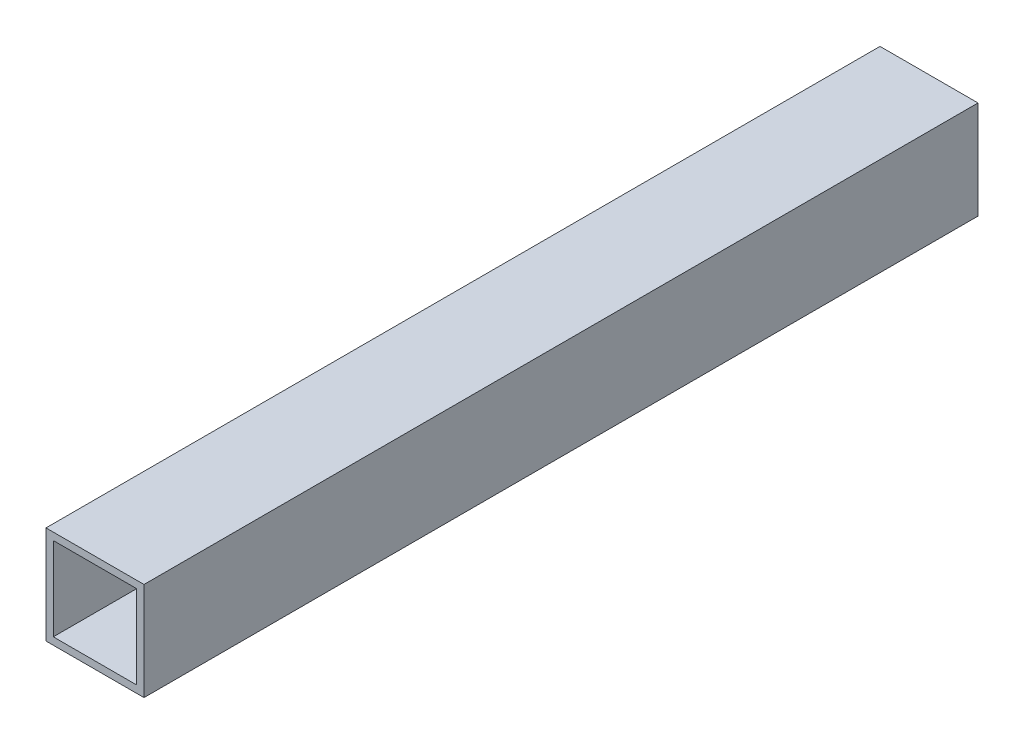
ISO-10303-21;
HEADER;
FILE_DESCRIPTION(('STEP AP214'),'2;1');
FILE_NAME('part.step','',(''),(''),'','','');
FILE_SCHEMA(('AUTOMOTIVE_DESIGN { 1 0 10303 214 1 1 1 1 }'));
ENDSEC;
DATA;
#1=APPLICATION_CONTEXT('core data for automotive mechanical design processes');
#2=APPLICATION_PROTOCOL_DEFINITION('international standard','automotive_design',2000,#1);
#3=PRODUCT_CONTEXT('',#1,'mechanical');
#4=PRODUCT('Part','Part','',(#3));
#5=PRODUCT_RELATED_PRODUCT_CATEGORY('part','',(#4));
#6=PRODUCT_DEFINITION_FORMATION('','',#4);
#7=PRODUCT_DEFINITION_CONTEXT('part definition',#1,'design');
#8=PRODUCT_DEFINITION('design','',#6,#7);
#9=PRODUCT_DEFINITION_SHAPE('','',#8);
#10=(LENGTH_UNIT() NAMED_UNIT(*) SI_UNIT(.MILLI.,.METRE.));
#11=(NAMED_UNIT(*) PLANE_ANGLE_UNIT() SI_UNIT($,.RADIAN.));
#12=(NAMED_UNIT(*) SI_UNIT($,.STERADIAN.) SOLID_ANGLE_UNIT());
#13=UNCERTAINTY_MEASURE_WITH_UNIT(LENGTH_MEASURE(1.E-05),#10,'distance_accuracy_value','');
#14=(GEOMETRIC_REPRESENTATION_CONTEXT(3) GLOBAL_UNCERTAINTY_ASSIGNED_CONTEXT((#13)) GLOBAL_UNIT_ASSIGNED_CONTEXT((#10,
#11,#12)) REPRESENTATION_CONTEXT('',''));
#15=CARTESIAN_POINT('',(0.,0.,0.));
#16=DIRECTION('',(0.,0.,1.));
#17=DIRECTION('',(1.,0.,0.));
#18=AXIS2_PLACEMENT_3D('',#15,#16,#17);
#19=CARTESIAN_POINT('',(0.,0.,200.));
#20=DIRECTION('',(0.,0.,-1.));
#21=DIRECTION('',(-1.,0.,0.));
#22=AXIS2_PLACEMENT_3D('',#19,#20,#21);
#23=PLANE('',#22);
#24=DIRECTION('',(0.,1.,0.));
#25=VECTOR('',#24,1.);
#26=CARTESIAN_POINT('',(11.75,-11.75,200.));
#27=LINE('',#26,#25);
#28=CARTESIAN_POINT('',(11.75,-11.75,200.));
#29=VERTEX_POINT('',#28);
#30=CARTESIAN_POINT('',(11.75,11.75,200.));
#31=VERTEX_POINT('',#30);
#32=EDGE_CURVE('E135',#29,#31,#27,.T.);
#33=ORIENTED_EDGE('',*,*,#32,.T.);
#34=DIRECTION('',(-1.,0.,0.));
#35=VECTOR('',#34,1.);
#36=CARTESIAN_POINT('',(-11.75,11.75,200.));
#37=LINE('',#36,#35);
#38=CARTESIAN_POINT('',(-11.75,11.75,200.));
#39=VERTEX_POINT('',#38);
#40=EDGE_CURVE('E138',#31,#39,#37,.T.);
#41=ORIENTED_EDGE('',*,*,#40,.T.);
#42=DIRECTION('',(0.,-1.,0.));
#43=VECTOR('',#42,1.);
#44=CARTESIAN_POINT('',(-11.75,-11.75,200.));
#45=LINE('',#44,#43);
#46=CARTESIAN_POINT('',(-11.75,-11.75,200.));
#47=VERTEX_POINT('',#46);
#48=EDGE_CURVE('E141',#39,#47,#45,.T.);
#49=ORIENTED_EDGE('',*,*,#48,.T.);
#50=DIRECTION('',(1.,0.,0.));
#51=VECTOR('',#50,1.);
#52=CARTESIAN_POINT('',(-11.75,-11.75,200.));
#53=LINE('',#52,#51);
#54=EDGE_CURVE('E143',#47,#29,#53,.T.);
#55=ORIENTED_EDGE('',*,*,#54,.T.);
#56=EDGE_LOOP('',(#33,#41,#49,#55));
#57=FACE_BOUND('',#56,.T.);
#58=DIRECTION('',(0.,1.,0.));
#59=VECTOR('',#58,1.);
#60=CARTESIAN_POINT('',(10.,-10.,200.));
#61=LINE('',#60,#59);
#62=CARTESIAN_POINT('',(10.,-10.,200.));
#63=VERTEX_POINT('',#62);
#64=CARTESIAN_POINT('',(10.,10.,200.));
#65=VERTEX_POINT('',#64);
#66=EDGE_CURVE('E98',#63,#65,#61,.T.);
#67=ORIENTED_EDGE('',*,*,#66,.F.);
#68=DIRECTION('',(1.,0.,0.));
#69=VECTOR('',#68,1.);
#70=CARTESIAN_POINT('',(-10.,-10.,200.));
#71=LINE('',#70,#69);
#72=CARTESIAN_POINT('',(-10.,-10.,200.));
#73=VERTEX_POINT('',#72);
#74=EDGE_CURVE('E120',#73,#63,#71,.T.);
#75=ORIENTED_EDGE('',*,*,#74,.F.);
#76=DIRECTION('',(0.,-1.,0.));
#77=VECTOR('',#76,1.);
#78=CARTESIAN_POINT('',(-10.,-10.,200.));
#79=LINE('',#78,#77);
#80=CARTESIAN_POINT('',(-10.,10.,200.));
#81=VERTEX_POINT('',#80);
#82=EDGE_CURVE('E118',#81,#73,#79,.T.);
#83=ORIENTED_EDGE('',*,*,#82,.F.);
#84=DIRECTION('',(-1.,0.,0.));
#85=VECTOR('',#84,1.);
#86=CARTESIAN_POINT('',(-10.,10.,200.));
#87=LINE('',#86,#85);
#88=EDGE_CURVE('E106',#65,#81,#87,.T.);
#89=ORIENTED_EDGE('',*,*,#88,.F.);
#90=EDGE_LOOP('',(#67,#75,#83,#89));
#91=FACE_BOUND('',#90,.T.);
#92=ADVANCED_FACE('F32',(#57,#91),#23,.F.);
#93=CARTESIAN_POINT('',(0.,0.,0.));
#94=DIRECTION('',(0.,0.,-1.));
#95=DIRECTION('',(-1.,0.,0.));
#96=AXIS2_PLACEMENT_3D('',#93,#94,#95);
#97=PLANE('',#96);
#98=DIRECTION('',(0.,1.,0.));
#99=VECTOR('',#98,1.);
#100=CARTESIAN_POINT('',(11.75,-11.75,0.));
#101=LINE('',#100,#99);
#102=CARTESIAN_POINT('',(11.75,-11.75,0.));
#103=VERTEX_POINT('',#102);
#104=CARTESIAN_POINT('',(11.75,11.75,0.));
#105=VERTEX_POINT('',#104);
#106=EDGE_CURVE('E114',#103,#105,#101,.T.);
#107=ORIENTED_EDGE('',*,*,#106,.F.);
#108=DIRECTION('',(1.,0.,0.));
#109=VECTOR('',#108,1.);
#110=CARTESIAN_POINT('',(-11.75,-11.75,0.));
#111=LINE('',#110,#109);
#112=CARTESIAN_POINT('',(-11.75,-11.75,0.));
#113=VERTEX_POINT('',#112);
#114=EDGE_CURVE('E139',#113,#103,#111,.T.);
#115=ORIENTED_EDGE('',*,*,#114,.F.);
#116=DIRECTION('',(0.,-1.,0.));
#117=VECTOR('',#116,1.);
#118=CARTESIAN_POINT('',(-11.75,-11.75,0.));
#119=LINE('',#118,#117);
#120=CARTESIAN_POINT('',(-11.75,11.75,0.));
#121=VERTEX_POINT('',#120);
#122=EDGE_CURVE('E150',#121,#113,#119,.T.);
#123=ORIENTED_EDGE('',*,*,#122,.F.);
#124=DIRECTION('',(-1.,0.,0.));
#125=VECTOR('',#124,1.);
#126=CARTESIAN_POINT('',(-11.75,11.75,0.));
#127=LINE('',#126,#125);
#128=EDGE_CURVE('E148',#105,#121,#127,.T.);
#129=ORIENTED_EDGE('',*,*,#128,.F.);
#130=EDGE_LOOP('',(#107,#115,#123,#129));
#131=FACE_BOUND('',#130,.T.);
#132=DIRECTION('',(1.,0.,0.));
#133=VECTOR('',#132,1.);
#134=CARTESIAN_POINT('',(-10.,-10.,0.));
#135=LINE('',#134,#133);
#136=CARTESIAN_POINT('',(-10.,-10.,0.));
#137=VERTEX_POINT('',#136);
#138=CARTESIAN_POINT('',(10.,-10.,0.));
#139=VERTEX_POINT('',#138);
#140=EDGE_CURVE('E107',#137,#139,#135,.T.);
#141=ORIENTED_EDGE('',*,*,#140,.T.);
#142=DIRECTION('',(0.,1.,0.));
#143=VECTOR('',#142,1.);
#144=CARTESIAN_POINT('',(10.,-10.,0.));
#145=LINE('',#144,#143);
#146=CARTESIAN_POINT('',(10.,10.,0.));
#147=VERTEX_POINT('',#146);
#148=EDGE_CURVE('E56',#139,#147,#145,.T.);
#149=ORIENTED_EDGE('',*,*,#148,.T.);
#150=DIRECTION('',(-1.,0.,0.));
#151=VECTOR('',#150,1.);
#152=CARTESIAN_POINT('',(-10.,10.,0.));
#153=LINE('',#152,#151);
#154=CARTESIAN_POINT('',(-10.,10.,0.));
#155=VERTEX_POINT('',#154);
#156=EDGE_CURVE('E113',#147,#155,#153,.T.);
#157=ORIENTED_EDGE('',*,*,#156,.T.);
#158=DIRECTION('',(0.,-1.,0.));
#159=VECTOR('',#158,1.);
#160=CARTESIAN_POINT('',(-10.,-10.,0.));
#161=LINE('',#160,#159);
#162=EDGE_CURVE('E127',#155,#137,#161,.T.);
#163=ORIENTED_EDGE('',*,*,#162,.T.);
#164=EDGE_LOOP('',(#141,#149,#157,#163));
#165=FACE_BOUND('',#164,.T.);
#166=ADVANCED_FACE('F169',(#131,#165),#97,.T.);
#167=CARTESIAN_POINT('',(11.75,-11.75,200.));
#168=DIRECTION('',(-1.,0.,0.));
#169=DIRECTION('',(0.,0.,1.));
#170=AXIS2_PLACEMENT_3D('',#167,#168,#169);
#171=PLANE('',#170);
#172=ORIENTED_EDGE('',*,*,#106,.T.);
#173=DIRECTION('',(0.,0.,-1.));
#174=VECTOR('',#173,1.);
#175=CARTESIAN_POINT('',(11.75,11.75,200.));
#176=LINE('',#175,#174);
#177=EDGE_CURVE('E11',#31,#105,#176,.T.);
#178=ORIENTED_EDGE('',*,*,#177,.F.);
#179=ORIENTED_EDGE('',*,*,#32,.F.);
#180=DIRECTION('',(0.,0.,-1.));
#181=VECTOR('',#180,1.);
#182=CARTESIAN_POINT('',(11.75,-11.75,200.));
#183=LINE('',#182,#181);
#184=EDGE_CURVE('E145',#29,#103,#183,.T.);
#185=ORIENTED_EDGE('',*,*,#184,.T.);
#186=EDGE_LOOP('',(#172,#178,#179,#185));
#187=FACE_BOUND('',#186,.T.);
#188=ADVANCED_FACE('F34',(#187),#171,.F.);
#189=CARTESIAN_POINT('',(-11.75,11.75,200.));
#190=DIRECTION('',(0.,-1.,0.));
#191=DIRECTION('',(0.,0.,-1.));
#192=AXIS2_PLACEMENT_3D('',#189,#190,#191);
#193=PLANE('',#192);
#194=ORIENTED_EDGE('',*,*,#128,.T.);
#195=DIRECTION('',(0.,0.,-1.));
#196=VECTOR('',#195,1.);
#197=CARTESIAN_POINT('',(-11.75,11.75,200.));
#198=LINE('',#197,#196);
#199=EDGE_CURVE('E41',#39,#121,#198,.T.);
#200=ORIENTED_EDGE('',*,*,#199,.F.);
#201=ORIENTED_EDGE('',*,*,#40,.F.);
#202=ORIENTED_EDGE('',*,*,#177,.T.);
#203=EDGE_LOOP('',(#194,#200,#201,#202));
#204=FACE_BOUND('',#203,.T.);
#205=ADVANCED_FACE('F179',(#204),#193,.F.);
#206=CARTESIAN_POINT('',(-11.75,-11.75,200.));
#207=DIRECTION('',(1.,0.,0.));
#208=DIRECTION('',(0.,0.,-1.));
#209=AXIS2_PLACEMENT_3D('',#206,#207,#208);
#210=PLANE('',#209);
#211=CARTESIAN_POINT('',(-11.75,0.,100.));
#212=DIRECTION('',(-1.,0.,0.));
#213=DIRECTION('',(0.,0.,1.));
#214=AXIS2_PLACEMENT_3D('',#211,#212,#213);
#215=CIRCLE('',#214,7.21025675119336);
#216=CARTESIAN_POINT('',(-11.75,0.,107.210256751193));
#217=VERTEX_POINT('',#216);
#218=EDGE_CURVE('E223',#217,#217,#215,.T.);
#219=ORIENTED_EDGE('',*,*,#218,.F.);
#220=EDGE_LOOP('',(#219));
#221=FACE_BOUND('',#220,.T.);
#222=ORIENTED_EDGE('',*,*,#122,.T.);
#223=DIRECTION('',(0.,0.,-1.));
#224=VECTOR('',#223,1.);
#225=CARTESIAN_POINT('',(-11.75,-11.75,200.));
#226=LINE('',#225,#224);
#227=EDGE_CURVE('E155',#47,#113,#226,.T.);
#228=ORIENTED_EDGE('',*,*,#227,.F.);
#229=ORIENTED_EDGE('',*,*,#48,.F.);
#230=ORIENTED_EDGE('',*,*,#199,.T.);
#231=EDGE_LOOP('',(#222,#228,#229,#230));
#232=FACE_BOUND('',#231,.T.);
#233=ADVANCED_FACE('F163',(#221,#232),#210,.F.);
#234=CARTESIAN_POINT('',(-11.75,-11.75,200.));
#235=DIRECTION('',(0.,1.,0.));
#236=DIRECTION('',(0.,0.,1.));
#237=AXIS2_PLACEMENT_3D('',#234,#235,#236);
#238=PLANE('',#237);
#239=ORIENTED_EDGE('',*,*,#114,.T.);
#240=ORIENTED_EDGE('',*,*,#184,.F.);
#241=ORIENTED_EDGE('',*,*,#54,.F.);
#242=ORIENTED_EDGE('',*,*,#227,.T.);
#243=EDGE_LOOP('',(#239,#240,#241,#242));
#244=FACE_BOUND('',#243,.T.);
#245=ADVANCED_FACE('F173',(#244),#238,.F.);
#246=CARTESIAN_POINT('',(10.,-10.,200.));
#247=DIRECTION('',(-1.,0.,0.));
#248=DIRECTION('',(0.,-1.,0.));
#249=AXIS2_PLACEMENT_3D('',#246,#247,#248);
#250=PLANE('',#249);
#251=ORIENTED_EDGE('',*,*,#148,.F.);
#252=DIRECTION('',(0.,0.,-1.));
#253=VECTOR('',#252,1.);
#254=CARTESIAN_POINT('',(10.,-10.,200.));
#255=LINE('',#254,#253);
#256=EDGE_CURVE('E102',#63,#139,#255,.T.);
#257=ORIENTED_EDGE('',*,*,#256,.F.);
#258=ORIENTED_EDGE('',*,*,#66,.T.);
#259=DIRECTION('',(0.,0.,-1.));
#260=VECTOR('',#259,1.);
#261=CARTESIAN_POINT('',(10.,10.,200.));
#262=LINE('',#261,#260);
#263=EDGE_CURVE('E101',#65,#147,#262,.T.);
#264=ORIENTED_EDGE('',*,*,#263,.T.);
#265=EDGE_LOOP('',(#251,#257,#258,#264));
#266=FACE_BOUND('',#265,.T.);
#267=ADVANCED_FACE('F100',(#266),#250,.T.);
#268=CARTESIAN_POINT('',(-10.,10.,200.));
#269=DIRECTION('',(0.,-1.,0.));
#270=DIRECTION('',(0.,0.,-1.));
#271=AXIS2_PLACEMENT_3D('',#268,#269,#270);
#272=PLANE('',#271);
#273=ORIENTED_EDGE('',*,*,#156,.F.);
#274=ORIENTED_EDGE('',*,*,#263,.F.);
#275=ORIENTED_EDGE('',*,*,#88,.T.);
#276=DIRECTION('',(0.,0.,-1.));
#277=VECTOR('',#276,1.);
#278=CARTESIAN_POINT('',(-10.,10.,200.));
#279=LINE('',#278,#277);
#280=EDGE_CURVE('E115',#81,#155,#279,.T.);
#281=ORIENTED_EDGE('',*,*,#280,.T.);
#282=EDGE_LOOP('',(#273,#274,#275,#281));
#283=FACE_BOUND('',#282,.T.);
#284=ADVANCED_FACE('F110',(#283),#272,.T.);
#285=CARTESIAN_POINT('',(-10.,-10.,200.));
#286=DIRECTION('',(1.,0.,0.));
#287=DIRECTION('',(0.,0.,-1.));
#288=AXIS2_PLACEMENT_3D('',#285,#286,#287);
#289=PLANE('',#288);
#290=CARTESIAN_POINT('',(-10.,0.,100.));
#291=DIRECTION('',(1.,0.,0.));
#292=DIRECTION('',(0.,0.,-1.));
#293=AXIS2_PLACEMENT_3D('',#290,#291,#292);
#294=CIRCLE('',#293,7.21025675119336);
#295=CARTESIAN_POINT('',(-10.,0.,92.7897432488066));
#296=VERTEX_POINT('',#295);
#297=EDGE_CURVE('E36',#296,#296,#294,.T.);
#298=ORIENTED_EDGE('',*,*,#297,.F.);
#299=EDGE_LOOP('',(#298));
#300=FACE_BOUND('',#299,.T.);
#301=ORIENTED_EDGE('',*,*,#162,.F.);
#302=ORIENTED_EDGE('',*,*,#280,.F.);
#303=ORIENTED_EDGE('',*,*,#82,.T.);
#304=DIRECTION('',(0.,0.,-1.));
#305=VECTOR('',#304,1.);
#306=CARTESIAN_POINT('',(-10.,-10.,200.));
#307=LINE('',#306,#305);
#308=EDGE_CURVE('E48',#73,#137,#307,.T.);
#309=ORIENTED_EDGE('',*,*,#308,.T.);
#310=EDGE_LOOP('',(#301,#302,#303,#309));
#311=FACE_BOUND('',#310,.T.);
#312=ADVANCED_FACE('F203',(#300,#311),#289,.T.);
#313=CARTESIAN_POINT('',(-10.,-10.,200.));
#314=DIRECTION('',(0.,1.,0.));
#315=DIRECTION('',(0.,0.,1.));
#316=AXIS2_PLACEMENT_3D('',#313,#314,#315);
#317=PLANE('',#316);
#318=ORIENTED_EDGE('',*,*,#140,.F.);
#319=ORIENTED_EDGE('',*,*,#308,.F.);
#320=ORIENTED_EDGE('',*,*,#74,.T.);
#321=ORIENTED_EDGE('',*,*,#256,.T.);
#322=EDGE_LOOP('',(#318,#319,#320,#321));
#323=FACE_BOUND('',#322,.T.);
#324=ADVANCED_FACE('F207',(#323),#317,.T.);
#325=CARTESIAN_POINT('',(10.,0.,100.));
#326=DIRECTION('',(-1.,0.,0.));
#327=DIRECTION('',(0.,0.,1.));
#328=AXIS2_PLACEMENT_3D('',#325,#326,#327);
#329=CYLINDRICAL_SURFACE('',#328,7.21025675119336);
#330=ORIENTED_EDGE('',*,*,#297,.T.);
#331=EDGE_LOOP('',(#330));
#332=FACE_BOUND('',#331,.T.);
#333=ORIENTED_EDGE('',*,*,#218,.T.);
#334=EDGE_LOOP('',(#333));
#335=FACE_BOUND('',#334,.T.);
#336=ADVANCED_FACE('F213',(#332,#335),#329,.F.);
#337=CLOSED_SHELL('',(#92,#166,#188,#205,#233,#245,#267,#284,#312,#324,#336));
#338=MANIFOLD_SOLID_BREP('B2',#337);
#339=ADVANCED_BREP_SHAPE_REPRESENTATION('',(#18,#338),#14);
#340=SHAPE_DEFINITION_REPRESENTATION(#9,#339);
ENDSEC;
END-ISO-10303-21;
